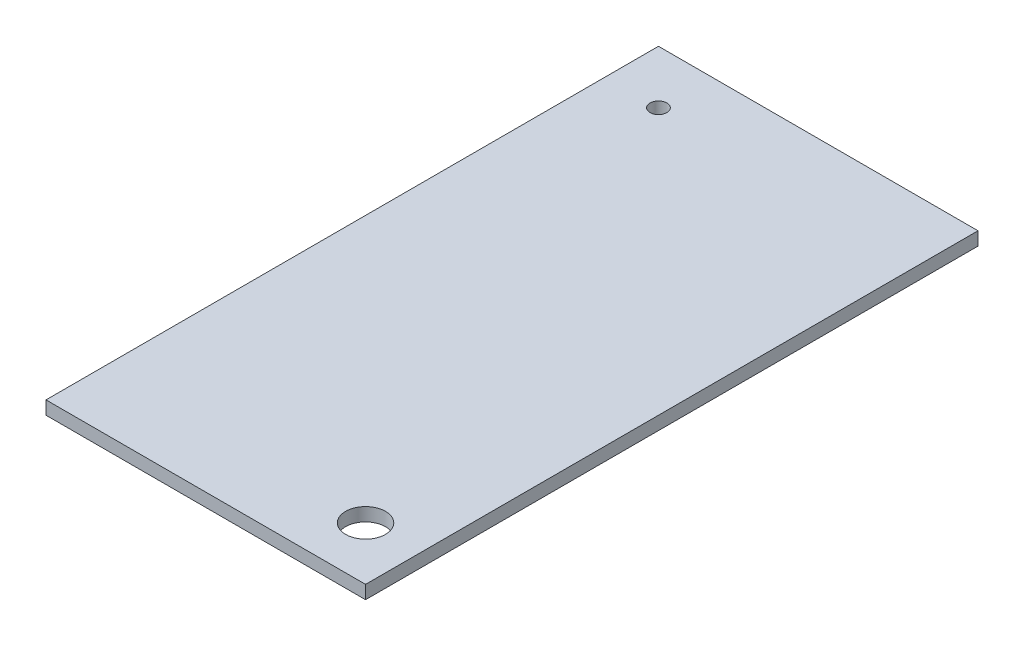
ISO-10303-21;
HEADER;
FILE_DESCRIPTION(('STEP AP214'),'2;1');
FILE_NAME('part.step','',(''),(''),'','','');
FILE_SCHEMA(('AUTOMOTIVE_DESIGN { 1 0 10303 214 1 1 1 1 }'));
ENDSEC;
DATA;
#1=APPLICATION_CONTEXT('core data for automotive mechanical design processes');
#2=APPLICATION_PROTOCOL_DEFINITION('international standard','automotive_design',2000,#1);
#3=PRODUCT_CONTEXT('',#1,'mechanical');
#4=PRODUCT('Part','Part','',(#3));
#5=PRODUCT_RELATED_PRODUCT_CATEGORY('part','',(#4));
#6=PRODUCT_DEFINITION_FORMATION('','',#4);
#7=PRODUCT_DEFINITION_CONTEXT('part definition',#1,'design');
#8=PRODUCT_DEFINITION('design','',#6,#7);
#9=PRODUCT_DEFINITION_SHAPE('','',#8);
#10=(LENGTH_UNIT() NAMED_UNIT(*) SI_UNIT(.MILLI.,.METRE.));
#11=(NAMED_UNIT(*) PLANE_ANGLE_UNIT() SI_UNIT($,.RADIAN.));
#12=(NAMED_UNIT(*) SI_UNIT($,.STERADIAN.) SOLID_ANGLE_UNIT());
#13=UNCERTAINTY_MEASURE_WITH_UNIT(LENGTH_MEASURE(1.E-05),#10,'distance_accuracy_value','');
#14=(GEOMETRIC_REPRESENTATION_CONTEXT(3) GLOBAL_UNCERTAINTY_ASSIGNED_CONTEXT((#13)) GLOBAL_UNIT_ASSIGNED_CONTEXT((#10,
#11,#12)) REPRESENTATION_CONTEXT('',''));
#15=CARTESIAN_POINT('',(0.,0.,0.));
#16=DIRECTION('',(0.,0.,1.));
#17=DIRECTION('',(1.,0.,0.));
#18=AXIS2_PLACEMENT_3D('',#15,#16,#17);
#19=CARTESIAN_POINT('',(0.,3.175,0.));
#20=DIRECTION('',(0.,0.,-1.));
#21=DIRECTION('',(-1.,0.,0.));
#22=AXIS2_PLACEMENT_3D('',#19,#20,#21);
#23=PLANE('',#22);
#24=DIRECTION('',(1.,0.,0.));
#25=VECTOR('',#24,1.);
#26=CARTESIAN_POINT('',(0.,0.,0.));
#27=LINE('',#26,#25);
#28=CARTESIAN_POINT('',(0.,0.,0.));
#29=VERTEX_POINT('',#28);
#30=CARTESIAN_POINT('',(76.2,0.,0.));
#31=VERTEX_POINT('',#30);
#32=EDGE_CURVE('E115',#29,#31,#27,.T.);
#33=ORIENTED_EDGE('',*,*,#32,.T.);
#34=DIRECTION('',(0.,-1.,0.));
#35=VECTOR('',#34,1.);
#36=CARTESIAN_POINT('',(76.2,3.175,0.));
#37=LINE('',#36,#35);
#38=CARTESIAN_POINT('',(76.2,3.175,0.));
#39=VERTEX_POINT('',#38);
#40=EDGE_CURVE('E13',#39,#31,#37,.T.);
#41=ORIENTED_EDGE('',*,*,#40,.F.);
#42=DIRECTION('',(1.,0.,0.));
#43=VECTOR('',#42,1.);
#44=CARTESIAN_POINT('',(0.,3.175,0.));
#45=LINE('',#44,#43);
#46=CARTESIAN_POINT('',(0.,3.175,0.));
#47=VERTEX_POINT('',#46);
#48=EDGE_CURVE('E95',#47,#39,#45,.T.);
#49=ORIENTED_EDGE('',*,*,#48,.F.);
#50=DIRECTION('',(0.,-1.,0.));
#51=VECTOR('',#50,1.);
#52=CARTESIAN_POINT('',(0.,3.175,0.));
#53=LINE('',#52,#51);
#54=EDGE_CURVE('E62',#47,#29,#53,.T.);
#55=ORIENTED_EDGE('',*,*,#54,.T.);
#56=EDGE_LOOP('',(#33,#41,#49,#55));
#57=FACE_BOUND('',#56,.T.);
#58=ADVANCED_FACE('F45',(#57),#23,.F.);
#59=CARTESIAN_POINT('',(76.2,3.175,0.));
#60=DIRECTION('',(-1.,0.,0.));
#61=DIRECTION('',(0.,0.,1.));
#62=AXIS2_PLACEMENT_3D('',#59,#60,#61);
#63=PLANE('',#62);
#64=DIRECTION('',(0.,0.,-1.));
#65=VECTOR('',#64,1.);
#66=CARTESIAN_POINT('',(76.2,0.,0.));
#67=LINE('',#66,#65);
#68=CARTESIAN_POINT('',(76.2,0.,-146.05));
#69=VERTEX_POINT('',#68);
#70=EDGE_CURVE('E100',#31,#69,#67,.T.);
#71=ORIENTED_EDGE('',*,*,#70,.T.);
#72=DIRECTION('',(0.,-1.,0.));
#73=VECTOR('',#72,1.);
#74=CARTESIAN_POINT('',(76.2,3.175,-146.05));
#75=LINE('',#74,#73);
#76=CARTESIAN_POINT('',(76.2,3.175,-146.05));
#77=VERTEX_POINT('',#76);
#78=EDGE_CURVE('E54',#77,#69,#75,.T.);
#79=ORIENTED_EDGE('',*,*,#78,.F.);
#80=DIRECTION('',(0.,0.,-1.));
#81=VECTOR('',#80,1.);
#82=CARTESIAN_POINT('',(76.2,3.175,0.));
#83=LINE('',#82,#81);
#84=EDGE_CURVE('E87',#39,#77,#83,.T.);
#85=ORIENTED_EDGE('',*,*,#84,.F.);
#86=ORIENTED_EDGE('',*,*,#40,.T.);
#87=EDGE_LOOP('',(#71,#79,#85,#86));
#88=FACE_BOUND('',#87,.T.);
#89=ADVANCED_FACE('F99',(#88),#63,.F.);
#90=CARTESIAN_POINT('',(0.,3.175,-146.05));
#91=DIRECTION('',(0.,0.,-1.));
#92=DIRECTION('',(-1.,0.,0.));
#93=AXIS2_PLACEMENT_3D('',#90,#91,#92);
#94=PLANE('',#93);
#95=DIRECTION('',(1.,0.,0.));
#96=VECTOR('',#95,1.);
#97=CARTESIAN_POINT('',(0.,0.,-146.05));
#98=LINE('',#97,#96);
#99=CARTESIAN_POINT('',(0.,0.,-146.05));
#100=VERTEX_POINT('',#99);
#101=EDGE_CURVE('E118',#100,#69,#98,.T.);
#102=ORIENTED_EDGE('',*,*,#101,.F.);
#103=DIRECTION('',(0.,-1.,0.));
#104=VECTOR('',#103,1.);
#105=CARTESIAN_POINT('',(0.,3.175,-146.05));
#106=LINE('',#105,#104);
#107=CARTESIAN_POINT('',(0.,3.175,-146.05));
#108=VERTEX_POINT('',#107);
#109=EDGE_CURVE('E76',#108,#100,#106,.T.);
#110=ORIENTED_EDGE('',*,*,#109,.F.);
#111=DIRECTION('',(1.,0.,0.));
#112=VECTOR('',#111,1.);
#113=CARTESIAN_POINT('',(0.,3.175,-146.05));
#114=LINE('',#113,#112);
#115=EDGE_CURVE('E94',#108,#77,#114,.T.);
#116=ORIENTED_EDGE('',*,*,#115,.T.);
#117=ORIENTED_EDGE('',*,*,#78,.T.);
#118=EDGE_LOOP('',(#102,#110,#116,#117));
#119=FACE_BOUND('',#118,.T.);
#120=ADVANCED_FACE('F103',(#119),#94,.T.);
#121=CARTESIAN_POINT('',(63.5,3.175,-12.7));
#122=DIRECTION('',(0.,-1.,0.));
#123=DIRECTION('',(0.,0.,-1.));
#124=AXIS2_PLACEMENT_3D('',#121,#122,#123);
#125=CYLINDRICAL_SURFACE('',#124,4.7625);
#126=CARTESIAN_POINT('',(63.5,3.175,-12.7));
#127=DIRECTION('',(0.,1.,0.));
#128=DIRECTION('',(0.,0.,1.));
#129=AXIS2_PLACEMENT_3D('',#126,#127,#128);
#130=CIRCLE('',#129,4.7625);
#131=CARTESIAN_POINT('',(63.5,3.175,-7.9375));
#132=VERTEX_POINT('',#131);
#133=EDGE_CURVE('E127',#132,#132,#130,.T.);
#134=ORIENTED_EDGE('',*,*,#133,.T.);
#135=EDGE_LOOP('',(#134));
#136=FACE_BOUND('',#135,.T.);
#137=CARTESIAN_POINT('',(63.5,0.,-12.7));
#138=DIRECTION('',(0.,1.,0.));
#139=DIRECTION('',(0.,0.,1.));
#140=AXIS2_PLACEMENT_3D('',#137,#138,#139);
#141=CIRCLE('',#140,4.7625);
#142=CARTESIAN_POINT('',(63.5,0.,-7.9375));
#143=VERTEX_POINT('',#142);
#144=EDGE_CURVE('E112',#143,#143,#141,.T.);
#145=ORIENTED_EDGE('',*,*,#144,.F.);
#146=EDGE_LOOP('',(#145));
#147=FACE_BOUND('',#146,.T.);
#148=ADVANCED_FACE('F135',(#136,#147),#125,.F.);
#149=CARTESIAN_POINT('',(12.7,3.175,-133.35));
#150=DIRECTION('',(0.,-1.,0.));
#151=DIRECTION('',(0.,0.,-1.));
#152=AXIS2_PLACEMENT_3D('',#149,#150,#151);
#153=CYLINDRICAL_SURFACE('',#152,2.);
#154=CARTESIAN_POINT('',(12.7,3.175,-133.35));
#155=DIRECTION('',(0.,1.,0.));
#156=DIRECTION('',(0.,0.,1.));
#157=AXIS2_PLACEMENT_3D('',#154,#155,#156);
#158=CIRCLE('',#157,2.);
#159=CARTESIAN_POINT('',(12.7,3.175,-131.35));
#160=VERTEX_POINT('',#159);
#161=EDGE_CURVE('E123',#160,#160,#158,.T.);
#162=ORIENTED_EDGE('',*,*,#161,.T.);
#163=EDGE_LOOP('',(#162));
#164=FACE_BOUND('',#163,.T.);
#165=CARTESIAN_POINT('',(12.7,0.,-133.35));
#166=DIRECTION('',(0.,1.,0.));
#167=DIRECTION('',(0.,0.,1.));
#168=AXIS2_PLACEMENT_3D('',#165,#166,#167);
#169=CIRCLE('',#168,2.);
#170=CARTESIAN_POINT('',(12.7,0.,-131.35));
#171=VERTEX_POINT('',#170);
#172=EDGE_CURVE('E109',#171,#171,#169,.T.);
#173=ORIENTED_EDGE('',*,*,#172,.F.);
#174=EDGE_LOOP('',(#173));
#175=FACE_BOUND('',#174,.T.);
#176=ADVANCED_FACE('F47',(#164,#175),#153,.F.);
#177=CARTESIAN_POINT('',(0.,3.175,0.));
#178=DIRECTION('',(-1.,0.,0.));
#179=DIRECTION('',(0.,0.,1.));
#180=AXIS2_PLACEMENT_3D('',#177,#178,#179);
#181=PLANE('',#180);
#182=DIRECTION('',(0.,0.,-1.));
#183=VECTOR('',#182,1.);
#184=CARTESIAN_POINT('',(0.,0.,0.));
#185=LINE('',#184,#183);
#186=EDGE_CURVE('E120',#29,#100,#185,.T.);
#187=ORIENTED_EDGE('',*,*,#186,.F.);
#188=ORIENTED_EDGE('',*,*,#54,.F.);
#189=DIRECTION('',(0.,0.,-1.));
#190=VECTOR('',#189,1.);
#191=CARTESIAN_POINT('',(0.,3.175,0.));
#192=LINE('',#191,#190);
#193=EDGE_CURVE('E104',#47,#108,#192,.T.);
#194=ORIENTED_EDGE('',*,*,#193,.T.);
#195=ORIENTED_EDGE('',*,*,#109,.T.);
#196=EDGE_LOOP('',(#187,#188,#194,#195));
#197=FACE_BOUND('',#196,.T.);
#198=ADVANCED_FACE('F140',(#197),#181,.T.);
#199=CARTESIAN_POINT('',(0.,3.175,0.));
#200=DIRECTION('',(0.,1.,0.));
#201=DIRECTION('',(0.,0.,1.));
#202=AXIS2_PLACEMENT_3D('',#199,#200,#201);
#203=PLANE('',#202);
#204=ORIENTED_EDGE('',*,*,#161,.F.);
#205=EDGE_LOOP('',(#204));
#206=FACE_BOUND('',#205,.T.);
#207=ORIENTED_EDGE('',*,*,#133,.F.);
#208=EDGE_LOOP('',(#207));
#209=FACE_BOUND('',#208,.T.);
#210=ORIENTED_EDGE('',*,*,#48,.T.);
#211=ORIENTED_EDGE('',*,*,#84,.T.);
#212=ORIENTED_EDGE('',*,*,#115,.F.);
#213=ORIENTED_EDGE('',*,*,#193,.F.);
#214=EDGE_LOOP('',(#210,#211,#212,#213));
#215=FACE_BOUND('',#214,.T.);
#216=ADVANCED_FACE('F91',(#206,#209,#215),#203,.T.);
#217=CARTESIAN_POINT('',(0.,0.,0.));
#218=DIRECTION('',(0.,1.,0.));
#219=DIRECTION('',(0.,0.,1.));
#220=AXIS2_PLACEMENT_3D('',#217,#218,#219);
#221=PLANE('',#220);
#222=ORIENTED_EDGE('',*,*,#172,.T.);
#223=EDGE_LOOP('',(#222));
#224=FACE_BOUND('',#223,.T.);
#225=ORIENTED_EDGE('',*,*,#144,.T.);
#226=EDGE_LOOP('',(#225));
#227=FACE_BOUND('',#226,.T.);
#228=ORIENTED_EDGE('',*,*,#32,.F.);
#229=ORIENTED_EDGE('',*,*,#186,.T.);
#230=ORIENTED_EDGE('',*,*,#101,.T.);
#231=ORIENTED_EDGE('',*,*,#70,.F.);
#232=EDGE_LOOP('',(#228,#229,#230,#231));
#233=FACE_BOUND('',#232,.T.);
#234=ADVANCED_FACE('F139',(#224,#227,#233),#221,.F.);
#235=CLOSED_SHELL('',(#58,#89,#120,#148,#176,#198,#216,#234));
#236=MANIFOLD_SOLID_BREP('B2',#235);
#237=ADVANCED_BREP_SHAPE_REPRESENTATION('',(#18,#236),#14);
#238=SHAPE_DEFINITION_REPRESENTATION(#9,#237);
ENDSEC;
END-ISO-10303-21;
